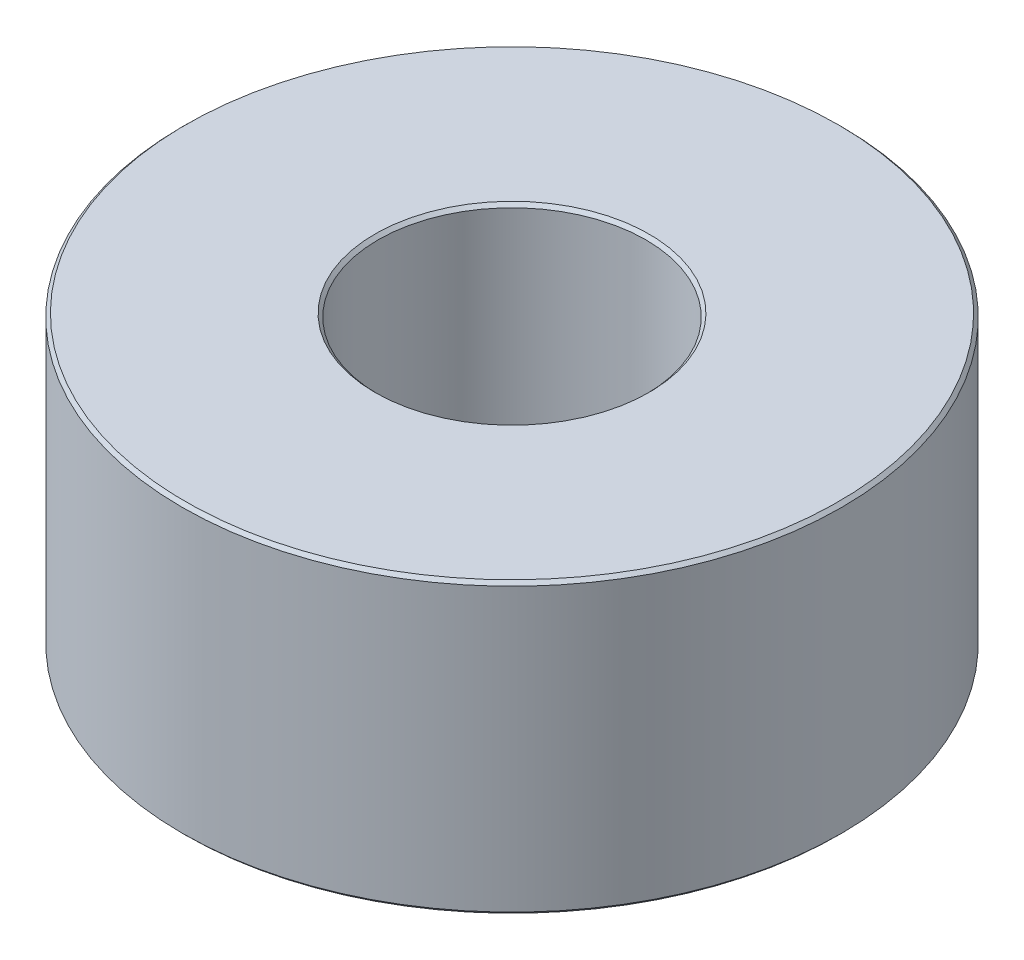
ISO-10303-21;
HEADER;
FILE_DESCRIPTION(('STEP AP214'),'2;1');
FILE_NAME('part.step','',(''),(''),'','','');
FILE_SCHEMA(('AUTOMOTIVE_DESIGN { 1 0 10303 214 1 1 1 1 }'));
ENDSEC;
DATA;
#1=APPLICATION_CONTEXT('core data for automotive mechanical design processes');
#2=APPLICATION_PROTOCOL_DEFINITION('international standard','automotive_design',2000,#1);
#3=PRODUCT_CONTEXT('',#1,'mechanical');
#4=PRODUCT('Part','Part','',(#3));
#5=PRODUCT_RELATED_PRODUCT_CATEGORY('part','',(#4));
#6=PRODUCT_DEFINITION_FORMATION('','',#4);
#7=PRODUCT_DEFINITION_CONTEXT('part definition',#1,'design');
#8=PRODUCT_DEFINITION('design','',#6,#7);
#9=PRODUCT_DEFINITION_SHAPE('','',#8);
#10=(LENGTH_UNIT() NAMED_UNIT(*) SI_UNIT(.MILLI.,.METRE.));
#11=(NAMED_UNIT(*) PLANE_ANGLE_UNIT() SI_UNIT($,.RADIAN.));
#12=(NAMED_UNIT(*) SI_UNIT($,.STERADIAN.) SOLID_ANGLE_UNIT());
#13=UNCERTAINTY_MEASURE_WITH_UNIT(LENGTH_MEASURE(1.E-05),#10,'distance_accuracy_value','');
#14=(GEOMETRIC_REPRESENTATION_CONTEXT(3) GLOBAL_UNCERTAINTY_ASSIGNED_CONTEXT((#13)) GLOBAL_UNIT_ASSIGNED_CONTEXT((#10,
#11,#12)) REPRESENTATION_CONTEXT('',''));
#15=CARTESIAN_POINT('',(0.,0.,0.));
#16=DIRECTION('',(0.,0.,1.));
#17=DIRECTION('',(1.,0.,0.));
#18=AXIS2_PLACEMENT_3D('',#15,#16,#17);
#19=CARTESIAN_POINT('',(0.,11.1252,0.));
#20=DIRECTION('',(0.,-1.,0.));
#21=DIRECTION('',(0.,0.,-1.));
#22=AXIS2_PLACEMENT_3D('',#19,#20,#21);
#23=CYLINDRICAL_SURFACE('',#22,5.1562);
#24=CARTESIAN_POINT('',(0.,0.127000000020416,0.));
#25=DIRECTION('',(0.,-1.,0.));
#26=DIRECTION('',(0.,0.,-1.));
#27=AXIS2_PLACEMENT_3D('',#24,#25,#26);
#28=CIRCLE('',#27,5.15620000004446);
#29=CARTESIAN_POINT('',(0.,0.127000000020416,-5.15620000004446));
#30=VERTEX_POINT('',#29);
#31=EDGE_CURVE('E30',#30,#30,#28,.T.);
#32=ORIENTED_EDGE('',*,*,#31,.T.);
#33=EDGE_LOOP('',(#32));
#34=FACE_BOUND('',#33,.T.);
#35=CARTESIAN_POINT('',(0.,10.9982000000173,0.));
#36=DIRECTION('',(0.,1.,0.));
#37=DIRECTION('',(0.,0.,1.));
#38=AXIS2_PLACEMENT_3D('',#35,#36,#37);
#39=CIRCLE('',#38,5.15619999993078);
#40=CARTESIAN_POINT('',(0.,10.9982000000173,5.15619999993078));
#41=VERTEX_POINT('',#40);
#42=EDGE_CURVE('E33',#41,#41,#39,.T.);
#43=ORIENTED_EDGE('',*,*,#42,.T.);
#44=EDGE_LOOP('',(#43));
#45=FACE_BOUND('',#44,.T.);
#46=ADVANCED_FACE('F15',(#34,#45),#23,.F.);
#47=CARTESIAN_POINT('',(0.,11.125199999924,0.));
#48=DIRECTION('',(0.,1.,0.));
#49=DIRECTION('',(0.,0.,1.));
#50=AXIS2_PLACEMENT_3D('',#47,#48,#49);
#51=CONICAL_SURFACE('',#50,5.28319999983751,0.785398163397448);
#52=ORIENTED_EDGE('',*,*,#42,.F.);
#53=EDGE_LOOP('',(#52));
#54=FACE_BOUND('',#53,.T.);
#55=CARTESIAN_POINT('',(0.,11.1251999999809,0.));
#56=DIRECTION('',(0.,1.,0.));
#57=DIRECTION('',(0.,0.,1.));
#58=AXIS2_PLACEMENT_3D('',#55,#56,#57);
#59=CIRCLE('',#58,5.28319999989435);
#60=CARTESIAN_POINT('',(0.,11.1251999999809,5.28319999989435));
#61=VERTEX_POINT('',#60);
#62=EDGE_CURVE('E18',#61,#61,#59,.F.);
#63=ORIENTED_EDGE('',*,*,#62,.F.);
#64=EDGE_LOOP('',(#63));
#65=FACE_BOUND('',#64,.T.);
#66=ADVANCED_FACE('F50',(#54,#65),#51,.F.);
#67=CARTESIAN_POINT('',(0.,1.13686837721616E-10,0.));
#68=DIRECTION('',(0.,-1.,0.));
#69=DIRECTION('',(0.,0.,-1.));
#70=AXIS2_PLACEMENT_3D('',#67,#68,#69);
#71=CONICAL_SURFACE('',#70,5.28319999995119,0.785398163397448);
#72=CARTESIAN_POINT('',(0.,0.,0.));
#73=DIRECTION('',(0.,-1.,0.));
#74=DIRECTION('',(0.,0.,-1.));
#75=AXIS2_PLACEMENT_3D('',#72,#73,#74);
#76=CIRCLE('',#75,5.28320000006488);
#77=CARTESIAN_POINT('',(0.,0.,-5.28320000006488));
#78=VERTEX_POINT('',#77);
#79=EDGE_CURVE('E40',#78,#78,#76,.T.);
#80=ORIENTED_EDGE('',*,*,#79,.T.);
#81=EDGE_LOOP('',(#80));
#82=FACE_BOUND('',#81,.T.);
#83=ORIENTED_EDGE('',*,*,#31,.F.);
#84=EDGE_LOOP('',(#83));
#85=FACE_BOUND('',#84,.T.);
#86=ADVANCED_FACE('F52',(#82,#85),#71,.F.);
#87=CARTESIAN_POINT('',(0.,11.1252,0.));
#88=DIRECTION('',(0.,1.,0.));
#89=DIRECTION('',(0.,0.,1.));
#90=AXIS2_PLACEMENT_3D('',#87,#88,#89);
#91=PLANE('',#90);
#92=ORIENTED_EDGE('',*,*,#62,.T.);
#93=EDGE_LOOP('',(#92));
#94=FACE_BOUND('',#93,.T.);
#95=CARTESIAN_POINT('',(0.,11.1252,0.));
#96=DIRECTION('',(0.,-1.,0.));
#97=DIRECTION('',(0.,0.,-1.));
#98=AXIS2_PLACEMENT_3D('',#95,#96,#97);
#99=CIRCLE('',#98,12.573);
#100=CARTESIAN_POINT('',(0.,11.1252,-12.573));
#101=VERTEX_POINT('',#100);
#102=EDGE_CURVE('E38',#101,#101,#99,.T.);
#103=ORIENTED_EDGE('',*,*,#102,.F.);
#104=EDGE_LOOP('',(#103));
#105=FACE_BOUND('',#104,.T.);
#106=ADVANCED_FACE('F47',(#94,#105),#91,.T.);
#107=CARTESIAN_POINT('',(0.,0.,0.));
#108=DIRECTION('',(0.,1.,0.));
#109=DIRECTION('',(0.,0.,1.));
#110=AXIS2_PLACEMENT_3D('',#107,#108,#109);
#111=PLANE('',#110);
#112=ORIENTED_EDGE('',*,*,#79,.F.);
#113=EDGE_LOOP('',(#112));
#114=FACE_BOUND('',#113,.T.);
#115=CARTESIAN_POINT('',(0.,0.,0.));
#116=DIRECTION('',(0.,1.,0.));
#117=DIRECTION('',(0.,0.,1.));
#118=AXIS2_PLACEMENT_3D('',#115,#116,#117);
#119=CIRCLE('',#118,12.573);
#120=CARTESIAN_POINT('',(0.,0.,12.573));
#121=VERTEX_POINT('',#120);
#122=EDGE_CURVE('E27',#121,#121,#119,.T.);
#123=ORIENTED_EDGE('',*,*,#122,.F.);
#124=EDGE_LOOP('',(#123));
#125=FACE_BOUND('',#124,.T.);
#126=ADVANCED_FACE('F76',(#114,#125),#111,.F.);
#127=CARTESIAN_POINT('',(0.,10.9982,0.));
#128=DIRECTION('',(0.,-1.,0.));
#129=DIRECTION('',(0.,0.,-1.));
#130=AXIS2_PLACEMENT_3D('',#127,#128,#129);
#131=CONICAL_SURFACE('',#130,12.7,0.785398163397428);
#132=CARTESIAN_POINT('',(0.,10.9982,0.));
#133=DIRECTION('',(0.,-1.,0.));
#134=DIRECTION('',(0.,0.,-1.));
#135=AXIS2_PLACEMENT_3D('',#132,#133,#134);
#136=CIRCLE('',#135,12.7);
#137=CARTESIAN_POINT('',(0.,10.9982,-12.7));
#138=VERTEX_POINT('',#137);
#139=EDGE_CURVE('E22',#138,#138,#136,.T.);
#140=ORIENTED_EDGE('',*,*,#139,.F.);
#141=EDGE_LOOP('',(#140));
#142=FACE_BOUND('',#141,.T.);
#143=ORIENTED_EDGE('',*,*,#102,.T.);
#144=EDGE_LOOP('',(#143));
#145=FACE_BOUND('',#144,.T.);
#146=ADVANCED_FACE('F69',(#142,#145),#131,.T.);
#147=CARTESIAN_POINT('',(0.,0.127000000000011,0.));
#148=DIRECTION('',(0.,1.,0.));
#149=DIRECTION('',(0.,0.,1.));
#150=AXIS2_PLACEMENT_3D('',#147,#148,#149);
#151=CONICAL_SURFACE('',#150,12.7,0.785398163397456);
#152=CARTESIAN_POINT('',(0.,0.127000000000011,0.));
#153=DIRECTION('',(0.,-1.,0.));
#154=DIRECTION('',(0.,0.,-1.));
#155=AXIS2_PLACEMENT_3D('',#152,#153,#154);
#156=CIRCLE('',#155,12.7);
#157=CARTESIAN_POINT('',(0.,0.127000000000011,-12.7));
#158=VERTEX_POINT('',#157);
#159=EDGE_CURVE('E10',#158,#158,#156,.F.);
#160=ORIENTED_EDGE('',*,*,#159,.F.);
#161=EDGE_LOOP('',(#160));
#162=FACE_BOUND('',#161,.T.);
#163=ORIENTED_EDGE('',*,*,#122,.T.);
#164=EDGE_LOOP('',(#163));
#165=FACE_BOUND('',#164,.T.);
#166=ADVANCED_FACE('F64',(#162,#165),#151,.T.);
#167=CARTESIAN_POINT('',(0.,11.1252,0.));
#168=DIRECTION('',(0.,-1.,0.));
#169=DIRECTION('',(0.,0.,-1.));
#170=AXIS2_PLACEMENT_3D('',#167,#168,#169);
#171=CYLINDRICAL_SURFACE('',#170,12.7);
#172=ORIENTED_EDGE('',*,*,#159,.T.);
#173=EDGE_LOOP('',(#172));
#174=FACE_BOUND('',#173,.T.);
#175=ORIENTED_EDGE('',*,*,#139,.T.);
#176=EDGE_LOOP('',(#175));
#177=FACE_BOUND('',#176,.T.);
#178=ADVANCED_FACE('F62',(#174,#177),#171,.T.);
#179=CLOSED_SHELL('',(#46,#66,#86,#106,#126,#146,#166,#178));
#180=MANIFOLD_SOLID_BREP('B1',#179);
#181=ADVANCED_BREP_SHAPE_REPRESENTATION('',(#18,#180),#14);
#182=SHAPE_DEFINITION_REPRESENTATION(#9,#181);
ENDSEC;
END-ISO-10303-21;
